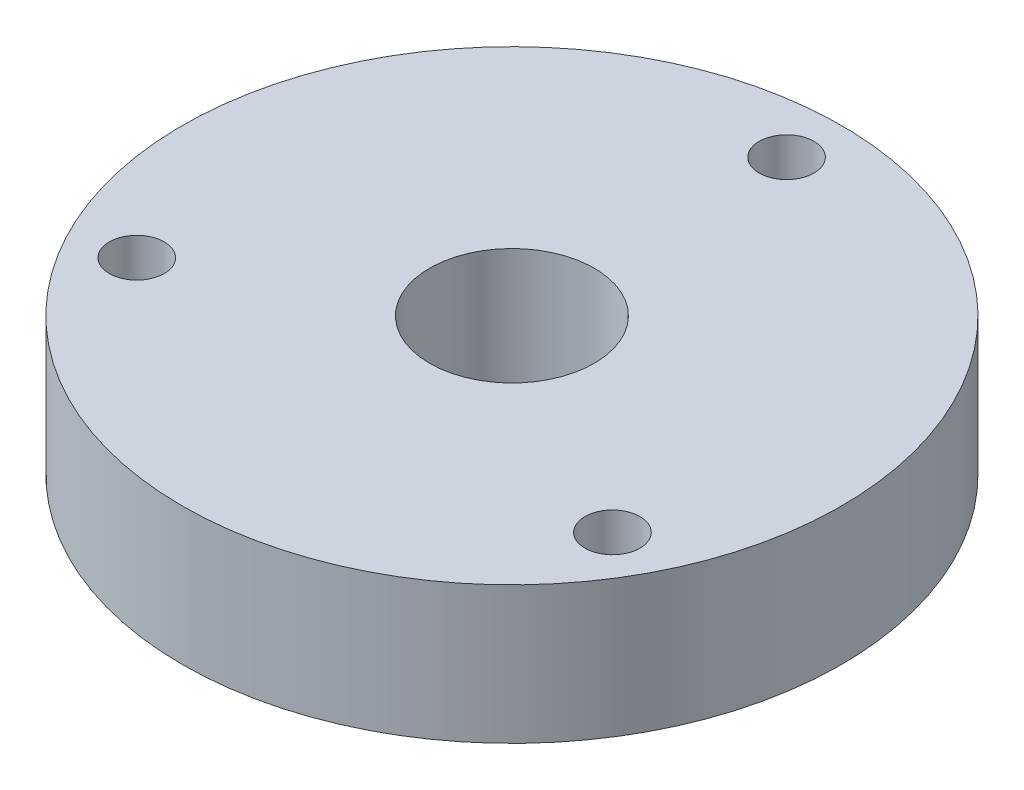
ISO-10303-21;
HEADER;
FILE_DESCRIPTION(('STEP AP214'),'2;1');
FILE_NAME('part.step','',(''),(''),'','','');
FILE_SCHEMA(('AUTOMOTIVE_DESIGN { 1 0 10303 214 1 1 1 1 }'));
ENDSEC;
DATA;
#1=APPLICATION_CONTEXT('core data for automotive mechanical design processes');
#2=APPLICATION_PROTOCOL_DEFINITION('international standard','automotive_design',2000,#1);
#3=PRODUCT_CONTEXT('',#1,'mechanical');
#4=PRODUCT('Part','Part','',(#3));
#5=PRODUCT_RELATED_PRODUCT_CATEGORY('part','',(#4));
#6=PRODUCT_DEFINITION_FORMATION('','',#4);
#7=PRODUCT_DEFINITION_CONTEXT('part definition',#1,'design');
#8=PRODUCT_DEFINITION('design','',#6,#7);
#9=PRODUCT_DEFINITION_SHAPE('','',#8);
#10=(LENGTH_UNIT() NAMED_UNIT(*) SI_UNIT(.MILLI.,.METRE.));
#11=(NAMED_UNIT(*) PLANE_ANGLE_UNIT() SI_UNIT($,.RADIAN.));
#12=(NAMED_UNIT(*) SI_UNIT($,.STERADIAN.) SOLID_ANGLE_UNIT());
#13=UNCERTAINTY_MEASURE_WITH_UNIT(LENGTH_MEASURE(1.E-05),#10,'distance_accuracy_value','');
#14=(GEOMETRIC_REPRESENTATION_CONTEXT(3) GLOBAL_UNCERTAINTY_ASSIGNED_CONTEXT((#13)) GLOBAL_UNIT_ASSIGNED_CONTEXT((#10,
#11,#12)) REPRESENTATION_CONTEXT('',''));
#15=CARTESIAN_POINT('',(0.,0.,0.));
#16=DIRECTION('',(0.,0.,1.));
#17=DIRECTION('',(1.,0.,0.));
#18=AXIS2_PLACEMENT_3D('',#15,#16,#17);
#19=CARTESIAN_POINT('',(0.,5.,0.));
#20=DIRECTION('',(0.,1.,0.));
#21=DIRECTION('',(0.,0.,1.));
#22=AXIS2_PLACEMENT_3D('',#19,#20,#21);
#23=PLANE('',#22);
#24=CARTESIAN_POINT('',(8.66025403784439,5.,5.));
#25=DIRECTION('',(0.,1.,0.));
#26=DIRECTION('',(0.,0.,1.));
#27=AXIS2_PLACEMENT_3D('',#24,#25,#26);
#28=CIRCLE('',#27,1.);
#29=CARTESIAN_POINT('',(8.66025403784439,5.,6.));
#30=VERTEX_POINT('',#29);
#31=EDGE_CURVE('E76',#30,#30,#28,.T.);
#32=ORIENTED_EDGE('',*,*,#31,.F.);
#33=EDGE_LOOP('',(#32));
#34=FACE_BOUND('',#33,.T.);
#35=CARTESIAN_POINT('',(0.,5.,-10.));
#36=DIRECTION('',(0.,1.,0.));
#37=DIRECTION('',(0.,0.,1.));
#38=AXIS2_PLACEMENT_3D('',#35,#36,#37);
#39=CIRCLE('',#38,1.);
#40=CARTESIAN_POINT('',(0.,5.,-9.));
#41=VERTEX_POINT('',#40);
#42=EDGE_CURVE('E63',#41,#41,#39,.T.);
#43=ORIENTED_EDGE('',*,*,#42,.F.);
#44=EDGE_LOOP('',(#43));
#45=FACE_BOUND('',#44,.T.);
#46=CARTESIAN_POINT('',(0.,5.,0.));
#47=DIRECTION('',(0.,1.,0.));
#48=DIRECTION('',(0.,0.,1.));
#49=AXIS2_PLACEMENT_3D('',#46,#47,#48);
#50=CIRCLE('',#49,12.);
#51=CARTESIAN_POINT('',(0.,5.,12.));
#52=VERTEX_POINT('',#51);
#53=EDGE_CURVE('E10',#52,#52,#50,.T.);
#54=ORIENTED_EDGE('',*,*,#53,.T.);
#55=EDGE_LOOP('',(#54));
#56=FACE_BOUND('',#55,.T.);
#57=CARTESIAN_POINT('',(0.,5.,0.));
#58=DIRECTION('',(0.,1.,0.));
#59=DIRECTION('',(0.,0.,1.));
#60=AXIS2_PLACEMENT_3D('',#57,#58,#59);
#61=CIRCLE('',#60,3.);
#62=CARTESIAN_POINT('',(0.,5.,3.));
#63=VERTEX_POINT('',#62);
#64=EDGE_CURVE('E69',#63,#63,#61,.T.);
#65=ORIENTED_EDGE('',*,*,#64,.F.);
#66=EDGE_LOOP('',(#65));
#67=FACE_BOUND('',#66,.T.);
#68=CARTESIAN_POINT('',(-8.66025403784439,5.,5.));
#69=DIRECTION('',(0.,1.,0.));
#70=DIRECTION('',(0.,0.,1.));
#71=AXIS2_PLACEMENT_3D('',#68,#69,#70);
#72=CIRCLE('',#71,1.);
#73=CARTESIAN_POINT('',(-8.66025403784439,5.,6.));
#74=VERTEX_POINT('',#73);
#75=EDGE_CURVE('E83',#74,#74,#72,.T.);
#76=ORIENTED_EDGE('',*,*,#75,.F.);
#77=EDGE_LOOP('',(#76));
#78=FACE_BOUND('',#77,.T.);
#79=ADVANCED_FACE('F47',(#34,#45,#56,#67,#78),#23,.T.);
#80=CARTESIAN_POINT('',(0.,0.,0.));
#81=DIRECTION('',(0.,1.,0.));
#82=DIRECTION('',(0.,0.,1.));
#83=AXIS2_PLACEMENT_3D('',#80,#81,#82);
#84=PLANE('',#83);
#85=CARTESIAN_POINT('',(0.,0.,0.));
#86=DIRECTION('',(0.,1.,0.));
#87=DIRECTION('',(0.,0.,1.));
#88=AXIS2_PLACEMENT_3D('',#85,#86,#87);
#89=CIRCLE('',#88,12.);
#90=CARTESIAN_POINT('',(0.,0.,12.));
#91=VERTEX_POINT('',#90);
#92=EDGE_CURVE('E51',#91,#91,#89,.T.);
#93=ORIENTED_EDGE('',*,*,#92,.F.);
#94=EDGE_LOOP('',(#93));
#95=FACE_BOUND('',#94,.T.);
#96=CARTESIAN_POINT('',(0.,0.,-10.));
#97=DIRECTION('',(0.,1.,0.));
#98=DIRECTION('',(0.,0.,1.));
#99=AXIS2_PLACEMENT_3D('',#96,#97,#98);
#100=CIRCLE('',#99,1.);
#101=CARTESIAN_POINT('',(0.,0.,-9.));
#102=VERTEX_POINT('',#101);
#103=EDGE_CURVE('E65',#102,#102,#100,.T.);
#104=ORIENTED_EDGE('',*,*,#103,.T.);
#105=EDGE_LOOP('',(#104));
#106=FACE_BOUND('',#105,.T.);
#107=CARTESIAN_POINT('',(0.,0.,0.));
#108=DIRECTION('',(0.,1.,0.));
#109=DIRECTION('',(0.,0.,1.));
#110=AXIS2_PLACEMENT_3D('',#107,#108,#109);
#111=CIRCLE('',#110,3.);
#112=CARTESIAN_POINT('',(0.,0.,3.));
#113=VERTEX_POINT('',#112);
#114=EDGE_CURVE('E73',#113,#113,#111,.T.);
#115=ORIENTED_EDGE('',*,*,#114,.T.);
#116=EDGE_LOOP('',(#115));
#117=FACE_BOUND('',#116,.T.);
#118=CARTESIAN_POINT('',(8.66025403784439,0.,5.));
#119=DIRECTION('',(0.,1.,0.));
#120=DIRECTION('',(0.,0.,1.));
#121=AXIS2_PLACEMENT_3D('',#118,#119,#120);
#122=CIRCLE('',#121,1.);
#123=CARTESIAN_POINT('',(8.66025403784439,0.,6.));
#124=VERTEX_POINT('',#123);
#125=EDGE_CURVE('E80',#124,#124,#122,.T.);
#126=ORIENTED_EDGE('',*,*,#125,.T.);
#127=EDGE_LOOP('',(#126));
#128=FACE_BOUND('',#127,.T.);
#129=CARTESIAN_POINT('',(-8.66025403784439,0.,5.));
#130=DIRECTION('',(0.,1.,0.));
#131=DIRECTION('',(0.,0.,1.));
#132=AXIS2_PLACEMENT_3D('',#129,#130,#131);
#133=CIRCLE('',#132,1.);
#134=CARTESIAN_POINT('',(-8.66025403784439,0.,6.));
#135=VERTEX_POINT('',#134);
#136=EDGE_CURVE('E87',#135,#135,#133,.T.);
#137=ORIENTED_EDGE('',*,*,#136,.T.);
#138=EDGE_LOOP('',(#137));
#139=FACE_BOUND('',#138,.T.);
#140=ADVANCED_FACE('F100',(#95,#106,#117,#128,#139),#84,.F.);
#141=CARTESIAN_POINT('',(0.,5.,0.));
#142=DIRECTION('',(0.,-1.,0.));
#143=DIRECTION('',(0.,0.,-1.));
#144=AXIS2_PLACEMENT_3D('',#141,#142,#143);
#145=CYLINDRICAL_SURFACE('',#144,12.);
#146=ORIENTED_EDGE('',*,*,#53,.F.);
#147=EDGE_LOOP('',(#146));
#148=FACE_BOUND('',#147,.T.);
#149=ORIENTED_EDGE('',*,*,#92,.T.);
#150=EDGE_LOOP('',(#149));
#151=FACE_BOUND('',#150,.T.);
#152=ADVANCED_FACE('F49',(#148,#151),#145,.T.);
#153=CARTESIAN_POINT('',(0.,5.,-10.));
#154=DIRECTION('',(0.,-1.,0.));
#155=DIRECTION('',(0.,0.,-1.));
#156=AXIS2_PLACEMENT_3D('',#153,#154,#155);
#157=CYLINDRICAL_SURFACE('',#156,1.);
#158=ORIENTED_EDGE('',*,*,#42,.T.);
#159=EDGE_LOOP('',(#158));
#160=FACE_BOUND('',#159,.T.);
#161=ORIENTED_EDGE('',*,*,#103,.F.);
#162=EDGE_LOOP('',(#161));
#163=FACE_BOUND('',#162,.T.);
#164=ADVANCED_FACE('F110',(#160,#163),#157,.F.);
#165=CARTESIAN_POINT('',(0.,5.,0.));
#166=DIRECTION('',(0.,-1.,0.));
#167=DIRECTION('',(0.,0.,-1.));
#168=AXIS2_PLACEMENT_3D('',#165,#166,#167);
#169=CYLINDRICAL_SURFACE('',#168,3.);
#170=ORIENTED_EDGE('',*,*,#64,.T.);
#171=EDGE_LOOP('',(#170));
#172=FACE_BOUND('',#171,.T.);
#173=ORIENTED_EDGE('',*,*,#114,.F.);
#174=EDGE_LOOP('',(#173));
#175=FACE_BOUND('',#174,.T.);
#176=ADVANCED_FACE('F113',(#172,#175),#169,.F.);
#177=CARTESIAN_POINT('',(8.66025403784439,5.,5.));
#178=DIRECTION('',(0.,-1.,0.));
#179=DIRECTION('',(0.,0.,-1.));
#180=AXIS2_PLACEMENT_3D('',#177,#178,#179);
#181=CYLINDRICAL_SURFACE('',#180,1.);
#182=ORIENTED_EDGE('',*,*,#31,.T.);
#183=EDGE_LOOP('',(#182));
#184=FACE_BOUND('',#183,.T.);
#185=ORIENTED_EDGE('',*,*,#125,.F.);
#186=EDGE_LOOP('',(#185));
#187=FACE_BOUND('',#186,.T.);
#188=ADVANCED_FACE('F117',(#184,#187),#181,.F.);
#189=CARTESIAN_POINT('',(-8.66025403784439,5.,5.));
#190=DIRECTION('',(0.,-1.,0.));
#191=DIRECTION('',(0.,0.,-1.));
#192=AXIS2_PLACEMENT_3D('',#189,#190,#191);
#193=CYLINDRICAL_SURFACE('',#192,1.);
#194=ORIENTED_EDGE('',*,*,#75,.T.);
#195=EDGE_LOOP('',(#194));
#196=FACE_BOUND('',#195,.T.);
#197=ORIENTED_EDGE('',*,*,#136,.F.);
#198=EDGE_LOOP('',(#197));
#199=FACE_BOUND('',#198,.T.);
#200=ADVANCED_FACE('F96',(#196,#199),#193,.F.);
#201=CLOSED_SHELL('',(#79,#140,#152,#164,#176,#188,#200));
#202=MANIFOLD_SOLID_BREP('B2',#201);
#203=ADVANCED_BREP_SHAPE_REPRESENTATION('',(#18,#202),#14);
#204=SHAPE_DEFINITION_REPRESENTATION(#9,#203);
ENDSEC;
END-ISO-10303-21;
